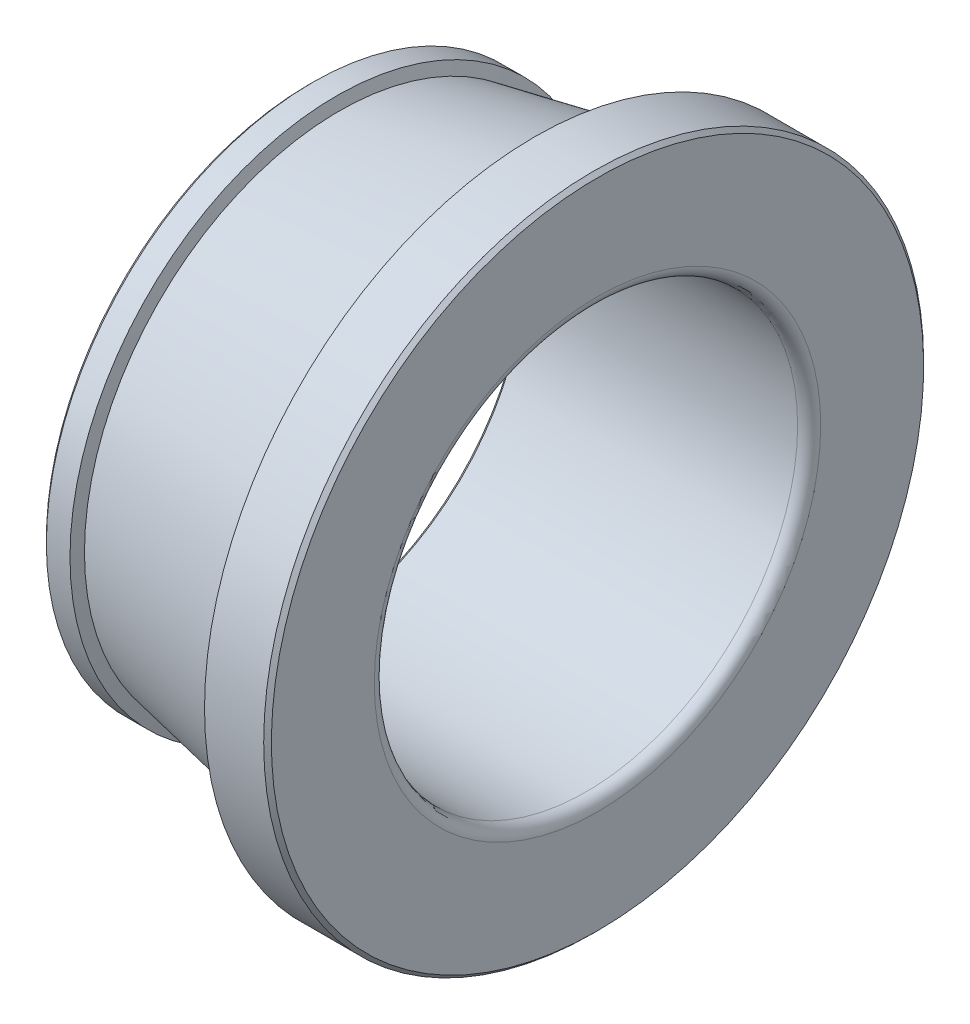
ISO-10303-21;
HEADER;
FILE_DESCRIPTION(('STEP AP214'),'2;1');
FILE_NAME('part.step','',(''),(''),'','','');
FILE_SCHEMA(('AUTOMOTIVE_DESIGN { 1 0 10303 214 1 1 1 1 }'));
ENDSEC;
DATA;
#1=APPLICATION_CONTEXT('core data for automotive mechanical design processes');
#2=APPLICATION_PROTOCOL_DEFINITION('international standard','automotive_design',2000,#1);
#3=PRODUCT_CONTEXT('',#1,'mechanical');
#4=PRODUCT('Part','Part','',(#3));
#5=PRODUCT_RELATED_PRODUCT_CATEGORY('part','',(#4));
#6=PRODUCT_DEFINITION_FORMATION('','',#4);
#7=PRODUCT_DEFINITION_CONTEXT('part definition',#1,'design');
#8=PRODUCT_DEFINITION('design','',#6,#7);
#9=PRODUCT_DEFINITION_SHAPE('','',#8);
#10=(LENGTH_UNIT() NAMED_UNIT(*) SI_UNIT(.MILLI.,.METRE.));
#11=(NAMED_UNIT(*) PLANE_ANGLE_UNIT() SI_UNIT($,.RADIAN.));
#12=(NAMED_UNIT(*) SI_UNIT($,.STERADIAN.) SOLID_ANGLE_UNIT());
#13=UNCERTAINTY_MEASURE_WITH_UNIT(LENGTH_MEASURE(1.E-05),#10,'distance_accuracy_value','');
#14=(GEOMETRIC_REPRESENTATION_CONTEXT(3) GLOBAL_UNCERTAINTY_ASSIGNED_CONTEXT((#13)) GLOBAL_UNIT_ASSIGNED_CONTEXT((#10,
#11,#12)) REPRESENTATION_CONTEXT('',''));
#15=CARTESIAN_POINT('',(0.,0.,0.));
#16=DIRECTION('',(0.,0.,1.));
#17=DIRECTION('',(1.,0.,0.));
#18=AXIS2_PLACEMENT_3D('',#15,#16,#17);
#19=CARTESIAN_POINT('',(12.2103155714432,0.,0.));
#20=DIRECTION('',(1.,0.,0.));
#21=DIRECTION('',(0.,0.,-1.));
#22=AXIS2_PLACEMENT_3D('',#19,#20,#21);
#23=CONICAL_SURFACE('',#22,15.3157221850017,0.1919862177);
#24=CARTESIAN_POINT('',(12.2103155715201,0.,0.));
#25=DIRECTION('',(-1.,0.,0.));
#26=DIRECTION('',(0.,0.,1.));
#27=AXIS2_PLACEMENT_3D('',#24,#25,#26);
#28=CIRCLE('',#27,15.315722185068);
#29=CARTESIAN_POINT('',(12.2103155715201,0.,15.315722185068));
#30=VERTEX_POINT('',#29);
#31=EDGE_CURVE('E82',#30,#30,#28,.T.);
#32=ORIENTED_EDGE('',*,*,#31,.T.);
#33=EDGE_LOOP('',(#32));
#34=FACE_BOUND('',#33,.T.);
#35=CARTESIAN_POINT('',(1.58497450230183,0.,0.));
#36=DIRECTION('',(-1.,0.,0.));
#37=DIRECTION('',(0.,0.,1.));
#38=AXIS2_PLACEMENT_3D('',#35,#36,#37);
#39=CIRCLE('',#38,13.2503651033331);
#40=CARTESIAN_POINT('',(1.58497450230183,0.,13.2503651033331));
#41=VERTEX_POINT('',#40);
#42=EDGE_CURVE('E77',#41,#41,#39,.T.);
#43=ORIENTED_EDGE('',*,*,#42,.F.);
#44=EDGE_LOOP('',(#43));
#45=FACE_BOUND('',#44,.T.);
#46=ADVANCED_FACE('F14',(#34,#45),#23,.T.);
#47=CARTESIAN_POINT('',(11.7245480779806,0.,0.));
#48=DIRECTION('',(-1.,0.,0.));
#49=DIRECTION('',(0.,-1.,0.));
#50=AXIS2_PLACEMENT_3D('',#47,#48,#49);
#51=CONICAL_SURFACE('',#50,17.15,1.3119116388);
#52=CARTESIAN_POINT('',(11.7245480779806,0.,0.));
#53=DIRECTION('',(-1.,0.,0.));
#54=DIRECTION('',(0.,0.,1.));
#55=AXIS2_PLACEMENT_3D('',#52,#53,#54);
#56=CIRCLE('',#55,17.15);
#57=CARTESIAN_POINT('',(11.7245480779806,0.,17.15));
#58=VERTEX_POINT('',#57);
#59=EDGE_CURVE('E72',#58,#58,#56,.F.);
#60=ORIENTED_EDGE('',*,*,#59,.F.);
#61=EDGE_LOOP('',(#60));
#62=FACE_BOUND('',#61,.T.);
#63=ORIENTED_EDGE('',*,*,#31,.F.);
#64=EDGE_LOOP('',(#63));
#65=FACE_BOUND('',#64,.T.);
#66=ADVANCED_FACE('F115',(#62,#65),#51,.F.);
#67=CARTESIAN_POINT('',(1.42749873665233,0.,0.));
#68=DIRECTION('',(-1.,0.,0.));
#69=DIRECTION('',(0.,-1.,0.));
#70=AXIS2_PLACEMENT_3D('',#67,#68,#69);
#71=CONICAL_SURFACE('',#70,13.8449999999904,1.3119116388);
#72=ORIENTED_EDGE('',*,*,#42,.T.);
#73=EDGE_LOOP('',(#72));
#74=FACE_BOUND('',#73,.T.);
#75=CARTESIAN_POINT('',(1.42749873668878,0.,0.));
#76=DIRECTION('',(-1.,0.,0.));
#77=DIRECTION('',(0.,0.,1.));
#78=AXIS2_PLACEMENT_3D('',#75,#76,#77);
#79=CIRCLE('',#78,13.845);
#80=CARTESIAN_POINT('',(1.42749873668878,0.,13.845));
#81=VERTEX_POINT('',#80);
#82=EDGE_CURVE('E67',#81,#81,#79,.T.);
#83=ORIENTED_EDGE('',*,*,#82,.F.);
#84=EDGE_LOOP('',(#83));
#85=FACE_BOUND('',#84,.T.);
#86=ADVANCED_FACE('F111',(#74,#85),#71,.T.);
#87=CARTESIAN_POINT('',(15.,0.,0.));
#88=DIRECTION('',(-1.,0.,0.));
#89=DIRECTION('',(0.,0.,1.));
#90=AXIS2_PLACEMENT_3D('',#87,#88,#89);
#91=CYLINDRICAL_SURFACE('',#90,17.15);
#92=CARTESIAN_POINT('',(14.8000000000005,0.,0.));
#93=DIRECTION('',(-1.,0.,0.));
#94=DIRECTION('',(0.,0.,1.));
#95=AXIS2_PLACEMENT_3D('',#92,#93,#94);
#96=CIRCLE('',#95,17.1500000000005);
#97=CARTESIAN_POINT('',(14.8000000000005,0.,17.1500000000005));
#98=VERTEX_POINT('',#97);
#99=EDGE_CURVE('E62',#98,#98,#96,.F.);
#100=ORIENTED_EDGE('',*,*,#99,.F.);
#101=EDGE_LOOP('',(#100));
#102=FACE_BOUND('',#101,.T.);
#103=ORIENTED_EDGE('',*,*,#59,.T.);
#104=EDGE_LOOP('',(#103));
#105=FACE_BOUND('',#104,.T.);
#106=ADVANCED_FACE('F108',(#102,#105),#91,.T.);
#107=CARTESIAN_POINT('',(15.,0.,0.));
#108=DIRECTION('',(-1.,0.,0.));
#109=DIRECTION('',(0.,0.,1.));
#110=AXIS2_PLACEMENT_3D('',#107,#108,#109);
#111=CYLINDRICAL_SURFACE('',#110,13.845);
#112=ORIENTED_EDGE('',*,*,#82,.T.);
#113=EDGE_LOOP('',(#112));
#114=FACE_BOUND('',#113,.T.);
#115=CARTESIAN_POINT('',(0.200000000000002,0.,0.));
#116=DIRECTION('',(1.,0.,0.));
#117=DIRECTION('',(0.,0.,-1.));
#118=AXIS2_PLACEMENT_3D('',#115,#116,#117);
#119=CIRCLE('',#118,13.845);
#120=CARTESIAN_POINT('',(0.200000000000002,0.,-13.845));
#121=VERTEX_POINT('',#120);
#122=EDGE_CURVE('E54',#121,#121,#119,.F.);
#123=ORIENTED_EDGE('',*,*,#122,.F.);
#124=EDGE_LOOP('',(#123));
#125=FACE_BOUND('',#124,.T.);
#126=ADVANCED_FACE('F104',(#114,#125),#111,.T.);
#127=CARTESIAN_POINT('',(14.8000000000005,0.,0.));
#128=DIRECTION('',(-1.,0.,0.));
#129=DIRECTION('',(0.,-1.,0.));
#130=AXIS2_PLACEMENT_3D('',#127,#128,#129);
#131=CONICAL_SURFACE('',#130,17.1500000000005,0.785398163400003);
#132=CARTESIAN_POINT('',(15.,0.,0.));
#133=DIRECTION('',(-1.,0.,0.));
#134=DIRECTION('',(0.,-1.,0.));
#135=AXIS2_PLACEMENT_3D('',#132,#133,#134);
#136=CIRCLE('',#135,16.95);
#137=CARTESIAN_POINT('',(15.,-16.95,0.));
#138=VERTEX_POINT('',#137);
#139=EDGE_CURVE('E17',#138,#138,#136,.F.);
#140=ORIENTED_EDGE('',*,*,#139,.F.);
#141=EDGE_LOOP('',(#140));
#142=FACE_BOUND('',#141,.T.);
#143=ORIENTED_EDGE('',*,*,#99,.T.);
#144=EDGE_LOOP('',(#143));
#145=FACE_BOUND('',#144,.T.);
#146=ADVANCED_FACE('F100',(#142,#145),#131,.T.);
#147=CARTESIAN_POINT('',(0.200000000000003,0.,0.));
#148=DIRECTION('',(1.,0.,0.));
#149=DIRECTION('',(0.,1.,0.));
#150=AXIS2_PLACEMENT_3D('',#147,#148,#149);
#151=CONICAL_SURFACE('',#150,13.845,0.7853981634);
#152=ORIENTED_EDGE('',*,*,#122,.T.);
#153=EDGE_LOOP('',(#152));
#154=FACE_BOUND('',#153,.T.);
#155=CARTESIAN_POINT('',(5.09656336231123E-13,0.,0.));
#156=DIRECTION('',(1.,0.,0.));
#157=DIRECTION('',(0.,1.,0.));
#158=AXIS2_PLACEMENT_3D('',#155,#156,#157);
#159=CIRCLE('',#158,13.6449999999995);
#160=CARTESIAN_POINT('',(5.09642979479008E-13,13.6449999999995,0.));
#161=VERTEX_POINT('',#160);
#162=EDGE_CURVE('E91',#161,#161,#159,.F.);
#163=ORIENTED_EDGE('',*,*,#162,.F.);
#164=EDGE_LOOP('',(#163));
#165=FACE_BOUND('',#164,.T.);
#166=ADVANCED_FACE('F103',(#154,#165),#151,.T.);
#167=CARTESIAN_POINT('',(15.,11.6,0.));
#168=DIRECTION('',(1.,0.,0.));
#169=DIRECTION('',(0.,0.,-1.));
#170=AXIS2_PLACEMENT_3D('',#167,#168,#169);
#171=PLANE('',#170);
#172=CARTESIAN_POINT('',(15.,0.,0.));
#173=DIRECTION('',(1.,0.,0.));
#174=DIRECTION('',(0.,0.,-1.));
#175=AXIS2_PLACEMENT_3D('',#172,#173,#174);
#176=CIRCLE('',#175,11.6);
#177=CARTESIAN_POINT('',(15.,0.,-11.6));
#178=VERTEX_POINT('',#177);
#179=EDGE_CURVE('E90',#178,#178,#176,.T.);
#180=ORIENTED_EDGE('',*,*,#179,.F.);
#181=EDGE_LOOP('',(#180));
#182=FACE_BOUND('',#181,.T.);
#183=ORIENTED_EDGE('',*,*,#139,.T.);
#184=EDGE_LOOP('',(#183));
#185=FACE_BOUND('',#184,.T.);
#186=ADVANCED_FACE('F98',(#182,#185),#171,.T.);
#187=CARTESIAN_POINT('',(0.,13.645,0.));
#188=DIRECTION('',(-1.,0.,0.));
#189=DIRECTION('',(0.,0.,1.));
#190=AXIS2_PLACEMENT_3D('',#187,#188,#189);
#191=PLANE('',#190);
#192=ORIENTED_EDGE('',*,*,#162,.T.);
#193=EDGE_LOOP('',(#192));
#194=FACE_BOUND('',#193,.T.);
#195=CARTESIAN_POINT('',(0.,0.,0.));
#196=DIRECTION('',(-1.,0.,0.));
#197=DIRECTION('',(0.,-1.,0.));
#198=AXIS2_PLACEMENT_3D('',#195,#196,#197);
#199=CIRCLE('',#198,11.2);
#200=CARTESIAN_POINT('',(0.,-11.2,0.));
#201=VERTEX_POINT('',#200);
#202=EDGE_CURVE('E26',#201,#201,#199,.F.);
#203=ORIENTED_EDGE('',*,*,#202,.T.);
#204=EDGE_LOOP('',(#203));
#205=FACE_BOUND('',#204,.T.);
#206=ADVANCED_FACE('F44',(#194,#205),#191,.T.);
#207=CARTESIAN_POINT('',(14.4,0.,0.));
#208=DIRECTION('',(1.,0.,0.));
#209=DIRECTION('',(0.,0.,-1.));
#210=AXIS2_PLACEMENT_3D('',#207,#208,#209);
#211=TOROIDAL_SURFACE('',#210,11.6,0.6);
#212=CARTESIAN_POINT('',(14.4,0.,0.));
#213=DIRECTION('',(-1.,0.,0.));
#214=DIRECTION('',(0.,0.,1.));
#215=AXIS2_PLACEMENT_3D('',#212,#213,#214);
#216=CIRCLE('',#215,11.);
#217=CARTESIAN_POINT('',(14.4,0.,11.));
#218=VERTEX_POINT('',#217);
#219=EDGE_CURVE('E21',#218,#218,#216,.T.);
#220=ORIENTED_EDGE('',*,*,#219,.T.);
#221=EDGE_LOOP('',(#220));
#222=FACE_BOUND('',#221,.T.);
#223=ORIENTED_EDGE('',*,*,#179,.T.);
#224=EDGE_LOOP('',(#223));
#225=FACE_BOUND('',#224,.T.);
#226=ADVANCED_FACE('F38',(#222,#225),#211,.T.);
#227=CARTESIAN_POINT('',(0.,0.,0.));
#228=DIRECTION('',(-1.,0.,0.));
#229=DIRECTION('',(0.,-1.,0.));
#230=AXIS2_PLACEMENT_3D('',#227,#228,#229);
#231=CONICAL_SURFACE('',#230,11.2,0.785398163399999);
#232=ORIENTED_EDGE('',*,*,#202,.F.);
#233=EDGE_LOOP('',(#232));
#234=FACE_BOUND('',#233,.T.);
#235=CARTESIAN_POINT('',(0.200000000000001,0.,0.));
#236=DIRECTION('',(-1.,0.,0.));
#237=DIRECTION('',(0.,0.,1.));
#238=AXIS2_PLACEMENT_3D('',#235,#236,#237);
#239=CIRCLE('',#238,11.);
#240=CARTESIAN_POINT('',(0.200000000000001,0.,11.));
#241=VERTEX_POINT('',#240);
#242=EDGE_CURVE('E10',#241,#241,#239,.F.);
#243=ORIENTED_EDGE('',*,*,#242,.T.);
#244=EDGE_LOOP('',(#243));
#245=FACE_BOUND('',#244,.T.);
#246=ADVANCED_FACE('F43',(#234,#245),#231,.F.);
#247=CARTESIAN_POINT('',(15.,0.,0.));
#248=DIRECTION('',(-1.,0.,0.));
#249=DIRECTION('',(0.,0.,1.));
#250=AXIS2_PLACEMENT_3D('',#247,#248,#249);
#251=CYLINDRICAL_SURFACE('',#250,11.);
#252=ORIENTED_EDGE('',*,*,#242,.F.);
#253=EDGE_LOOP('',(#252));
#254=FACE_BOUND('',#253,.T.);
#255=ORIENTED_EDGE('',*,*,#219,.F.);
#256=EDGE_LOOP('',(#255));
#257=FACE_BOUND('',#256,.T.);
#258=ADVANCED_FACE('F142',(#254,#257),#251,.F.);
#259=CLOSED_SHELL('',(#46,#66,#86,#106,#126,#146,#166,#186,#206,#226,#246,#258));
#260=MANIFOLD_SOLID_BREP('B1',#259);
#261=ADVANCED_BREP_SHAPE_REPRESENTATION('',(#18,#260),#14);
#262=SHAPE_DEFINITION_REPRESENTATION(#9,#261);
ENDSEC;
END-ISO-10303-21;
